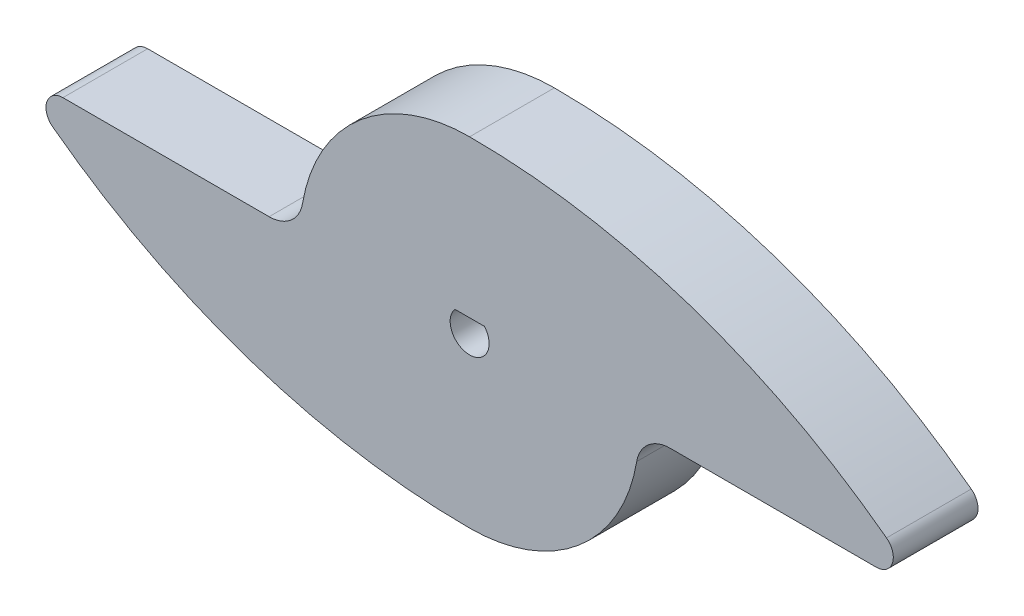
ISO-10303-21;
HEADER;
FILE_DESCRIPTION(('STEP AP214'),'2;1');
FILE_NAME('part.step','',(''),(''),'','','');
FILE_SCHEMA(('AUTOMOTIVE_DESIGN { 1 0 10303 214 1 1 1 1 }'));
ENDSEC;
DATA;
#1=APPLICATION_CONTEXT('core data for automotive mechanical design processes');
#2=APPLICATION_PROTOCOL_DEFINITION('international standard','automotive_design',2000,#1);
#3=PRODUCT_CONTEXT('',#1,'mechanical');
#4=PRODUCT('Part','Part','',(#3));
#5=PRODUCT_RELATED_PRODUCT_CATEGORY('part','',(#4));
#6=PRODUCT_DEFINITION_FORMATION('','',#4);
#7=PRODUCT_DEFINITION_CONTEXT('part definition',#1,'design');
#8=PRODUCT_DEFINITION('design','',#6,#7);
#9=PRODUCT_DEFINITION_SHAPE('','',#8);
#10=(LENGTH_UNIT() NAMED_UNIT(*) SI_UNIT(.MILLI.,.METRE.));
#11=(NAMED_UNIT(*) PLANE_ANGLE_UNIT() SI_UNIT($,.RADIAN.));
#12=(NAMED_UNIT(*) SI_UNIT($,.STERADIAN.) SOLID_ANGLE_UNIT());
#13=UNCERTAINTY_MEASURE_WITH_UNIT(LENGTH_MEASURE(1.E-05),#10,'distance_accuracy_value','');
#14=(GEOMETRIC_REPRESENTATION_CONTEXT(3) GLOBAL_UNCERTAINTY_ASSIGNED_CONTEXT((#13)) GLOBAL_UNIT_ASSIGNED_CONTEXT((#10,
#11,#12)) REPRESENTATION_CONTEXT('',''));
#15=CARTESIAN_POINT('',(0.,0.,0.));
#16=DIRECTION('',(0.,0.,1.));
#17=DIRECTION('',(1.,0.,0.));
#18=AXIS2_PLACEMENT_3D('',#15,#16,#17);
#19=CARTESIAN_POINT('',(0.,0.,6.35));
#20=DIRECTION('',(0.,0.,-1.));
#21=DIRECTION('',(-1.,0.,0.));
#22=AXIS2_PLACEMENT_3D('',#19,#20,#21);
#23=CYLINDRICAL_SURFACE('',#22,1.4605);
#24=DIRECTION('',(0.,0.,-1.));
#25=VECTOR('',#24,1.);
#26=CARTESIAN_POINT('',(1.10716033165933,0.9525,6.35));
#27=LINE('',#26,#25);
#28=CARTESIAN_POINT('',(1.10716033165933,0.9525,6.35));
#29=VERTEX_POINT('',#28);
#30=CARTESIAN_POINT('',(1.10716033165933,0.9525,-4.7625));
#31=VERTEX_POINT('',#30);
#32=EDGE_CURVE('E45',#29,#31,#27,.T.);
#33=ORIENTED_EDGE('',*,*,#32,.T.);
#34=CARTESIAN_POINT('',(0.,0.,-4.7625));
#35=DIRECTION('',(0.,0.,1.));
#36=DIRECTION('',(1.,0.,0.));
#37=AXIS2_PLACEMENT_3D('',#34,#35,#36);
#38=CIRCLE('',#37,1.4605);
#39=CARTESIAN_POINT('',(-1.10716033165933,0.9525,-4.7625));
#40=VERTEX_POINT('',#39);
#41=EDGE_CURVE('E289',#40,#31,#38,.T.);
#42=ORIENTED_EDGE('',*,*,#41,.F.);
#43=DIRECTION('',(0.,0.,-1.));
#44=VECTOR('',#43,1.);
#45=CARTESIAN_POINT('',(-1.10716033165933,0.9525,6.35));
#46=LINE('',#45,#44);
#47=CARTESIAN_POINT('',(-1.10716033165933,0.9525,6.35));
#48=VERTEX_POINT('',#47);
#49=EDGE_CURVE('E11',#48,#40,#46,.T.);
#50=ORIENTED_EDGE('',*,*,#49,.F.);
#51=CARTESIAN_POINT('',(0.,0.,6.35));
#52=DIRECTION('',(0.,0.,1.));
#53=DIRECTION('',(1.,0.,0.));
#54=AXIS2_PLACEMENT_3D('',#51,#52,#53);
#55=CIRCLE('',#54,1.4605);
#56=EDGE_CURVE('E138',#48,#29,#55,.T.);
#57=ORIENTED_EDGE('',*,*,#56,.T.);
#58=EDGE_LOOP('',(#33,#42,#50,#57));
#59=FACE_BOUND('',#58,.T.);
#60=ADVANCED_FACE('F35',(#59),#23,.F.);
#61=CARTESIAN_POINT('',(-15.026842649073,2.54,6.35));
#62=DIRECTION('',(0.,0.,-1.));
#63=DIRECTION('',(-1.,0.,0.));
#64=AXIS2_PLACEMENT_3D('',#61,#62,#63);
#65=CYLINDRICAL_SURFACE('',#64,2.54);
#66=CARTESIAN_POINT('',(-15.026842649073,2.54,0.));
#67=DIRECTION('',(0.,0.,1.));
#68=DIRECTION('',(1.,0.,0.));
#69=AXIS2_PLACEMENT_3D('',#66,#67,#68);
#70=CIRCLE('',#69,2.54);
#71=CARTESIAN_POINT('',(-15.026842649073,0.,0.));
#72=VERTEX_POINT('',#71);
#73=CARTESIAN_POINT('',(-12.5223688742275,2.11666666666667,0.));
#74=VERTEX_POINT('',#73);
#75=EDGE_CURVE('E173',#72,#74,#70,.T.);
#76=ORIENTED_EDGE('',*,*,#75,.F.);
#77=DIRECTION('',(0.,0.,-1.));
#78=VECTOR('',#77,1.);
#79=CARTESIAN_POINT('',(-15.026842649073,0.,6.35));
#80=LINE('',#79,#78);
#81=CARTESIAN_POINT('',(-15.026842649073,0.,6.35));
#82=VERTEX_POINT('',#81);
#83=EDGE_CURVE('E102',#82,#72,#80,.T.);
#84=ORIENTED_EDGE('',*,*,#83,.F.);
#85=CARTESIAN_POINT('',(-15.026842649073,2.54,6.35));
#86=DIRECTION('',(0.,0.,1.));
#87=DIRECTION('',(1.,0.,0.));
#88=AXIS2_PLACEMENT_3D('',#85,#86,#87);
#89=CIRCLE('',#88,2.54);
#90=CARTESIAN_POINT('',(-12.5223688742275,2.11666666666667,6.35));
#91=VERTEX_POINT('',#90);
#92=EDGE_CURVE('E134',#82,#91,#89,.T.);
#93=ORIENTED_EDGE('',*,*,#92,.T.);
#94=DIRECTION('',(0.,0.,-1.));
#95=VECTOR('',#94,1.);
#96=CARTESIAN_POINT('',(-12.5223688742275,2.11666666666667,6.35));
#97=LINE('',#96,#95);
#98=EDGE_CURVE('E98',#91,#74,#97,.T.);
#99=ORIENTED_EDGE('',*,*,#98,.T.);
#100=EDGE_LOOP('',(#76,#84,#93,#99));
#101=FACE_BOUND('',#100,.T.);
#102=ADVANCED_FACE('F37',(#101),#65,.F.);
#103=CARTESIAN_POINT('',(0.,0.,6.35));
#104=DIRECTION('',(0.,-1.,0.));
#105=DIRECTION('',(1.,0.,0.));
#106=AXIS2_PLACEMENT_3D('',#103,#104,#105);
#107=PLANE('',#106);
#108=DIRECTION('',(-1.,0.,0.));
#109=VECTOR('',#108,1.);
#110=CARTESIAN_POINT('',(0.,0.,0.));
#111=LINE('',#110,#109);
#112=CARTESIAN_POINT('',(-30.48,0.,0.));
#113=VERTEX_POINT('',#112);
#114=EDGE_CURVE('E175',#72,#113,#111,.T.);
#115=ORIENTED_EDGE('',*,*,#114,.T.);
#116=DIRECTION('',(0.,0.,-1.));
#117=VECTOR('',#116,1.);
#118=CARTESIAN_POINT('',(-30.48,0.,6.35));
#119=LINE('',#118,#117);
#120=CARTESIAN_POINT('',(-30.48,0.,6.35));
#121=VERTEX_POINT('',#120);
#122=EDGE_CURVE('E213',#121,#113,#119,.T.);
#123=ORIENTED_EDGE('',*,*,#122,.F.);
#124=DIRECTION('',(-1.,0.,0.));
#125=VECTOR('',#124,1.);
#126=CARTESIAN_POINT('',(0.,0.,6.35));
#127=LINE('',#126,#125);
#128=EDGE_CURVE('E144',#82,#121,#127,.T.);
#129=ORIENTED_EDGE('',*,*,#128,.F.);
#130=ORIENTED_EDGE('',*,*,#83,.T.);
#131=EDGE_LOOP('',(#115,#123,#129,#130));
#132=FACE_BOUND('',#131,.T.);
#133=ADVANCED_FACE('F216',(#132),#107,.F.);
#134=CARTESIAN_POINT('',(-30.48,-1.27,6.35));
#135=DIRECTION('',(0.,0.,-1.));
#136=DIRECTION('',(-1.,0.,0.));
#137=AXIS2_PLACEMENT_3D('',#134,#135,#136);
#138=CYLINDRICAL_SURFACE('',#137,1.27);
#139=CARTESIAN_POINT('',(-30.48,-1.27,0.));
#140=DIRECTION('',(0.,0.,1.));
#141=DIRECTION('',(1.,0.,0.));
#142=AXIS2_PLACEMENT_3D('',#139,#140,#141);
#143=CIRCLE('',#142,1.27);
#144=CARTESIAN_POINT('',(-31.242,-2.28600000000002,0.));
#145=VERTEX_POINT('',#144);
#146=EDGE_CURVE('E178',#145,#113,#143,.F.);
#147=ORIENTED_EDGE('',*,*,#146,.F.);
#148=DIRECTION('',(0.,0.,-1.));
#149=VECTOR('',#148,1.);
#150=CARTESIAN_POINT('',(-31.242,-2.28600000000002,6.35));
#151=LINE('',#150,#149);
#152=CARTESIAN_POINT('',(-31.242,-2.28600000000002,6.35));
#153=VERTEX_POINT('',#152);
#154=EDGE_CURVE('E211',#153,#145,#151,.T.);
#155=ORIENTED_EDGE('',*,*,#154,.F.);
#156=CARTESIAN_POINT('',(-30.48,-1.27,6.35));
#157=DIRECTION('',(0.,0.,1.));
#158=DIRECTION('',(1.,0.,0.));
#159=AXIS2_PLACEMENT_3D('',#156,#157,#158);
#160=CIRCLE('',#159,1.27);
#161=EDGE_CURVE('E146',#153,#121,#160,.F.);
#162=ORIENTED_EDGE('',*,*,#161,.T.);
#163=ORIENTED_EDGE('',*,*,#122,.T.);
#164=EDGE_LOOP('',(#147,#155,#162,#163));
#165=FACE_BOUND('',#164,.T.);
#166=ADVANCED_FACE('F224',(#165),#138,.T.);
#167=CARTESIAN_POINT('',(0.,39.37,6.35));
#168=DIRECTION('',(0.,0.,-1.));
#169=DIRECTION('',(-1.,0.,0.));
#170=AXIS2_PLACEMENT_3D('',#167,#168,#169);
#171=CYLINDRICAL_SURFACE('',#170,52.07);
#172=CARTESIAN_POINT('',(0.,39.37,0.));
#173=DIRECTION('',(0.,0.,1.));
#174=DIRECTION('',(1.,0.,0.));
#175=AXIS2_PLACEMENT_3D('',#172,#173,#174);
#176=CIRCLE('',#175,52.07);
#177=CARTESIAN_POINT('',(0.,-12.7,0.));
#178=VERTEX_POINT('',#177);
#179=EDGE_CURVE('E181',#178,#145,#176,.F.);
#180=ORIENTED_EDGE('',*,*,#179,.F.);
#181=DIRECTION('',(0.,0.,-1.));
#182=VECTOR('',#181,1.);
#183=CARTESIAN_POINT('',(0.,-12.7,6.35));
#184=LINE('',#183,#182);
#185=CARTESIAN_POINT('',(0.,-12.7,6.35));
#186=VERTEX_POINT('',#185);
#187=EDGE_CURVE('E209',#186,#178,#184,.T.);
#188=ORIENTED_EDGE('',*,*,#187,.F.);
#189=CARTESIAN_POINT('',(0.,39.37,6.35));
#190=DIRECTION('',(0.,0.,1.));
#191=DIRECTION('',(1.,0.,0.));
#192=AXIS2_PLACEMENT_3D('',#189,#190,#191);
#193=CIRCLE('',#192,52.07);
#194=EDGE_CURVE('E156',#186,#153,#193,.F.);
#195=ORIENTED_EDGE('',*,*,#194,.T.);
#196=ORIENTED_EDGE('',*,*,#154,.T.);
#197=EDGE_LOOP('',(#180,#188,#195,#196));
#198=FACE_BOUND('',#197,.T.);
#199=ADVANCED_FACE('F228',(#198),#171,.T.);
#200=CARTESIAN_POINT('',(0.,0.,6.35));
#201=DIRECTION('',(0.,0.,-1.));
#202=DIRECTION('',(-1.,0.,0.));
#203=AXIS2_PLACEMENT_3D('',#200,#201,#202);
#204=CYLINDRICAL_SURFACE('',#203,12.7);
#205=CARTESIAN_POINT('',(0.,0.,0.));
#206=DIRECTION('',(0.,0.,1.));
#207=DIRECTION('',(1.,0.,0.));
#208=AXIS2_PLACEMENT_3D('',#205,#206,#207);
#209=CIRCLE('',#208,12.7);
#210=CARTESIAN_POINT('',(12.5223688742275,-2.11666666666668,0.));
#211=VERTEX_POINT('',#210);
#212=EDGE_CURVE('E184',#178,#211,#209,.T.);
#213=ORIENTED_EDGE('',*,*,#212,.T.);
#214=DIRECTION('',(0.,0.,-1.));
#215=VECTOR('',#214,1.);
#216=CARTESIAN_POINT('',(12.5223688742275,-2.11666666666668,6.35));
#217=LINE('',#216,#215);
#218=CARTESIAN_POINT('',(12.5223688742275,-2.11666666666668,6.35));
#219=VERTEX_POINT('',#218);
#220=EDGE_CURVE('E207',#219,#211,#217,.T.);
#221=ORIENTED_EDGE('',*,*,#220,.F.);
#222=CARTESIAN_POINT('',(0.,0.,6.35));
#223=DIRECTION('',(0.,0.,1.));
#224=DIRECTION('',(1.,0.,0.));
#225=AXIS2_PLACEMENT_3D('',#222,#223,#224);
#226=CIRCLE('',#225,12.7);
#227=EDGE_CURVE('E159',#186,#219,#226,.T.);
#228=ORIENTED_EDGE('',*,*,#227,.F.);
#229=ORIENTED_EDGE('',*,*,#187,.T.);
#230=EDGE_LOOP('',(#213,#221,#228,#229));
#231=FACE_BOUND('',#230,.T.);
#232=ADVANCED_FACE('F232',(#231),#204,.T.);
#233=CARTESIAN_POINT('',(15.026842649073,-2.54,6.35));
#234=DIRECTION('',(0.,0.,-1.));
#235=DIRECTION('',(-1.,0.,0.));
#236=AXIS2_PLACEMENT_3D('',#233,#234,#235);
#237=CYLINDRICAL_SURFACE('',#236,2.54);
#238=CARTESIAN_POINT('',(15.026842649073,-2.54,0.));
#239=DIRECTION('',(0.,0.,1.));
#240=DIRECTION('',(1.,0.,0.));
#241=AXIS2_PLACEMENT_3D('',#238,#239,#240);
#242=CIRCLE('',#241,2.54);
#243=CARTESIAN_POINT('',(15.026842649073,0.,0.));
#244=VERTEX_POINT('',#243);
#245=EDGE_CURVE('E187',#244,#211,#242,.T.);
#246=ORIENTED_EDGE('',*,*,#245,.F.);
#247=DIRECTION('',(0.,0.,-1.));
#248=VECTOR('',#247,1.);
#249=CARTESIAN_POINT('',(15.026842649073,0.,6.35));
#250=LINE('',#249,#248);
#251=CARTESIAN_POINT('',(15.026842649073,0.,6.35));
#252=VERTEX_POINT('',#251);
#253=EDGE_CURVE('E205',#252,#244,#250,.T.);
#254=ORIENTED_EDGE('',*,*,#253,.F.);
#255=CARTESIAN_POINT('',(15.026842649073,-2.54,6.35));
#256=DIRECTION('',(0.,0.,1.));
#257=DIRECTION('',(1.,0.,0.));
#258=AXIS2_PLACEMENT_3D('',#255,#256,#257);
#259=CIRCLE('',#258,2.54);
#260=EDGE_CURVE('E161',#252,#219,#259,.T.);
#261=ORIENTED_EDGE('',*,*,#260,.T.);
#262=ORIENTED_EDGE('',*,*,#220,.T.);
#263=EDGE_LOOP('',(#246,#254,#261,#262));
#264=FACE_BOUND('',#263,.T.);
#265=ADVANCED_FACE('F238',(#264),#237,.F.);
#266=CARTESIAN_POINT('',(0.,0.,6.35));
#267=DIRECTION('',(0.,1.,0.));
#268=DIRECTION('',(0.,0.,1.));
#269=AXIS2_PLACEMENT_3D('',#266,#267,#268);
#270=PLANE('',#269);
#271=DIRECTION('',(1.,0.,0.));
#272=VECTOR('',#271,1.);
#273=CARTESIAN_POINT('',(0.,0.,0.));
#274=LINE('',#273,#272);
#275=CARTESIAN_POINT('',(30.48,0.,0.));
#276=VERTEX_POINT('',#275);
#277=EDGE_CURVE('E190',#244,#276,#274,.T.);
#278=ORIENTED_EDGE('',*,*,#277,.T.);
#279=DIRECTION('',(0.,0.,-1.));
#280=VECTOR('',#279,1.);
#281=CARTESIAN_POINT('',(30.48,0.,6.35));
#282=LINE('',#281,#280);
#283=CARTESIAN_POINT('',(30.48,0.,6.35));
#284=VERTEX_POINT('',#283);
#285=EDGE_CURVE('E203',#284,#276,#282,.T.);
#286=ORIENTED_EDGE('',*,*,#285,.F.);
#287=DIRECTION('',(1.,0.,0.));
#288=VECTOR('',#287,1.);
#289=CARTESIAN_POINT('',(0.,0.,6.35));
#290=LINE('',#289,#288);
#291=EDGE_CURVE('E164',#252,#284,#290,.T.);
#292=ORIENTED_EDGE('',*,*,#291,.F.);
#293=ORIENTED_EDGE('',*,*,#253,.T.);
#294=EDGE_LOOP('',(#278,#286,#292,#293));
#295=FACE_BOUND('',#294,.T.);
#296=ADVANCED_FACE('F241',(#295),#270,.F.);
#297=CARTESIAN_POINT('',(30.48,1.27,6.35));
#298=DIRECTION('',(0.,0.,-1.));
#299=DIRECTION('',(-1.,0.,0.));
#300=AXIS2_PLACEMENT_3D('',#297,#298,#299);
#301=CYLINDRICAL_SURFACE('',#300,1.27);
#302=CARTESIAN_POINT('',(30.48,1.27,0.));
#303=DIRECTION('',(0.,0.,1.));
#304=DIRECTION('',(1.,0.,0.));
#305=AXIS2_PLACEMENT_3D('',#302,#303,#304);
#306=CIRCLE('',#305,1.27);
#307=CARTESIAN_POINT('',(31.242,2.28600000000001,0.));
#308=VERTEX_POINT('',#307);
#309=EDGE_CURVE('E193',#308,#276,#306,.F.);
#310=ORIENTED_EDGE('',*,*,#309,.F.);
#311=DIRECTION('',(0.,0.,-1.));
#312=VECTOR('',#311,1.);
#313=CARTESIAN_POINT('',(31.242,2.28600000000001,6.35));
#314=LINE('',#313,#312);
#315=CARTESIAN_POINT('',(31.242,2.28600000000001,6.35));
#316=VERTEX_POINT('',#315);
#317=EDGE_CURVE('E201',#316,#308,#314,.T.);
#318=ORIENTED_EDGE('',*,*,#317,.F.);
#319=CARTESIAN_POINT('',(30.48,1.27,6.35));
#320=DIRECTION('',(0.,0.,1.));
#321=DIRECTION('',(1.,0.,0.));
#322=AXIS2_PLACEMENT_3D('',#319,#320,#321);
#323=CIRCLE('',#322,1.27);
#324=EDGE_CURVE('E166',#316,#284,#323,.F.);
#325=ORIENTED_EDGE('',*,*,#324,.T.);
#326=ORIENTED_EDGE('',*,*,#285,.T.);
#327=EDGE_LOOP('',(#310,#318,#325,#326));
#328=FACE_BOUND('',#327,.T.);
#329=ADVANCED_FACE('F244',(#328),#301,.T.);
#330=CARTESIAN_POINT('',(0.,-39.37,6.35));
#331=DIRECTION('',(0.,0.,-1.));
#332=DIRECTION('',(-1.,0.,0.));
#333=AXIS2_PLACEMENT_3D('',#330,#331,#332);
#334=CYLINDRICAL_SURFACE('',#333,52.07);
#335=CARTESIAN_POINT('',(0.,-39.37,0.));
#336=DIRECTION('',(0.,0.,1.));
#337=DIRECTION('',(1.,0.,0.));
#338=AXIS2_PLACEMENT_3D('',#335,#336,#337);
#339=CIRCLE('',#338,52.07);
#340=CARTESIAN_POINT('',(0.,12.7,0.));
#341=VERTEX_POINT('',#340);
#342=EDGE_CURVE('E148',#341,#308,#339,.F.);
#343=ORIENTED_EDGE('',*,*,#342,.F.);
#344=DIRECTION('',(0.,0.,-1.));
#345=VECTOR('',#344,1.);
#346=CARTESIAN_POINT('',(0.,12.7,6.35));
#347=LINE('',#346,#345);
#348=CARTESIAN_POINT('',(0.,12.7,6.35));
#349=VERTEX_POINT('',#348);
#350=EDGE_CURVE('E90',#349,#341,#347,.T.);
#351=ORIENTED_EDGE('',*,*,#350,.F.);
#352=CARTESIAN_POINT('',(0.,-39.37,6.35));
#353=DIRECTION('',(0.,0.,1.));
#354=DIRECTION('',(1.,0.,0.));
#355=AXIS2_PLACEMENT_3D('',#352,#353,#354);
#356=CIRCLE('',#355,52.07);
#357=EDGE_CURVE('E137',#349,#316,#356,.F.);
#358=ORIENTED_EDGE('',*,*,#357,.T.);
#359=ORIENTED_EDGE('',*,*,#317,.T.);
#360=EDGE_LOOP('',(#343,#351,#358,#359));
#361=FACE_BOUND('',#360,.T.);
#362=ADVANCED_FACE('F247',(#361),#334,.T.);
#363=CARTESIAN_POINT('',(0.,0.,6.35));
#364=DIRECTION('',(0.,0.,-1.));
#365=DIRECTION('',(-1.,0.,0.));
#366=AXIS2_PLACEMENT_3D('',#363,#364,#365);
#367=CYLINDRICAL_SURFACE('',#366,12.7);
#368=CARTESIAN_POINT('',(0.,0.,0.));
#369=DIRECTION('',(0.,0.,1.));
#370=DIRECTION('',(1.,0.,0.));
#371=AXIS2_PLACEMENT_3D('',#368,#369,#370);
#372=CIRCLE('',#371,12.7);
#373=EDGE_CURVE('E141',#341,#74,#372,.T.);
#374=ORIENTED_EDGE('',*,*,#373,.T.);
#375=ORIENTED_EDGE('',*,*,#98,.F.);
#376=CARTESIAN_POINT('',(0.,0.,6.35));
#377=DIRECTION('',(0.,0.,1.));
#378=DIRECTION('',(1.,0.,0.));
#379=AXIS2_PLACEMENT_3D('',#376,#377,#378);
#380=CIRCLE('',#379,12.7);
#381=EDGE_CURVE('E132',#349,#91,#380,.T.);
#382=ORIENTED_EDGE('',*,*,#381,.F.);
#383=ORIENTED_EDGE('',*,*,#350,.T.);
#384=EDGE_LOOP('',(#374,#375,#382,#383));
#385=FACE_BOUND('',#384,.T.);
#386=ADVANCED_FACE('F140',(#385),#367,.T.);
#387=CARTESIAN_POINT('',(0.,0.9525,6.35));
#388=DIRECTION('',(0.,1.,0.));
#389=DIRECTION('',(0.,0.,1.));
#390=AXIS2_PLACEMENT_3D('',#387,#388,#389);
#391=PLANE('',#390);
#392=ORIENTED_EDGE('',*,*,#49,.T.);
#393=DIRECTION('',(-1.,0.,0.));
#394=VECTOR('',#393,1.);
#395=CARTESIAN_POINT('',(-1.10716033165933,0.9525,-4.7625));
#396=LINE('',#395,#394);
#397=EDGE_CURVE('E285',#31,#40,#396,.T.);
#398=ORIENTED_EDGE('',*,*,#397,.F.);
#399=ORIENTED_EDGE('',*,*,#32,.F.);
#400=DIRECTION('',(1.,0.,0.));
#401=VECTOR('',#400,1.);
#402=CARTESIAN_POINT('',(0.,0.9525,6.35));
#403=LINE('',#402,#401);
#404=EDGE_CURVE('E53',#48,#29,#403,.T.);
#405=ORIENTED_EDGE('',*,*,#404,.F.);
#406=EDGE_LOOP('',(#392,#398,#399,#405));
#407=FACE_BOUND('',#406,.T.);
#408=ADVANCED_FACE('F254',(#407),#391,.F.);
#409=CARTESIAN_POINT('',(0.,0.,6.35));
#410=DIRECTION('',(0.,0.,1.));
#411=DIRECTION('',(1.,0.,0.));
#412=AXIS2_PLACEMENT_3D('',#409,#410,#411);
#413=PLANE('',#412);
#414=ORIENTED_EDGE('',*,*,#92,.F.);
#415=ORIENTED_EDGE('',*,*,#128,.T.);
#416=ORIENTED_EDGE('',*,*,#161,.F.);
#417=ORIENTED_EDGE('',*,*,#194,.F.);
#418=ORIENTED_EDGE('',*,*,#227,.T.);
#419=ORIENTED_EDGE('',*,*,#260,.F.);
#420=ORIENTED_EDGE('',*,*,#291,.T.);
#421=ORIENTED_EDGE('',*,*,#324,.F.);
#422=ORIENTED_EDGE('',*,*,#357,.F.);
#423=ORIENTED_EDGE('',*,*,#381,.T.);
#424=EDGE_LOOP('',(#414,#415,#416,#417,#418,#419,#420,#421,#422,#423));
#425=FACE_BOUND('',#424,.T.);
#426=ORIENTED_EDGE('',*,*,#56,.F.);
#427=ORIENTED_EDGE('',*,*,#404,.T.);
#428=EDGE_LOOP('',(#426,#427));
#429=FACE_BOUND('',#428,.T.);
#430=ADVANCED_FACE('F133',(#425,#429),#413,.T.);
#431=CARTESIAN_POINT('',(0.,0.,0.));
#432=DIRECTION('',(0.,0.,1.));
#433=DIRECTION('',(1.,0.,0.));
#434=AXIS2_PLACEMENT_3D('',#431,#432,#433);
#435=PLANE('',#434);
#436=CARTESIAN_POINT('',(0.,0.,0.));
#437=DIRECTION('',(0.,0.,1.));
#438=DIRECTION('',(1.,0.,0.));
#439=AXIS2_PLACEMENT_3D('',#436,#437,#438);
#440=CIRCLE('',#439,3.175);
#441=CARTESIAN_POINT('',(3.175,0.,0.));
#442=VERTEX_POINT('',#441);
#443=EDGE_CURVE('E39',#442,#442,#440,.T.);
#444=ORIENTED_EDGE('',*,*,#443,.T.);
#445=EDGE_LOOP('',(#444));
#446=FACE_BOUND('',#445,.T.);
#447=ORIENTED_EDGE('',*,*,#75,.T.);
#448=ORIENTED_EDGE('',*,*,#373,.F.);
#449=ORIENTED_EDGE('',*,*,#342,.T.);
#450=ORIENTED_EDGE('',*,*,#309,.T.);
#451=ORIENTED_EDGE('',*,*,#277,.F.);
#452=ORIENTED_EDGE('',*,*,#245,.T.);
#453=ORIENTED_EDGE('',*,*,#212,.F.);
#454=ORIENTED_EDGE('',*,*,#179,.T.);
#455=ORIENTED_EDGE('',*,*,#146,.T.);
#456=ORIENTED_EDGE('',*,*,#114,.F.);
#457=EDGE_LOOP('',(#447,#448,#449,#450,#451,#452,#453,#454,#455,#456));
#458=FACE_BOUND('',#457,.T.);
#459=ADVANCED_FACE('F219',(#446,#458),#435,.F.);
#460=CARTESIAN_POINT('',(0.,0.,-4.7625));
#461=DIRECTION('',(0.,0.,1.));
#462=DIRECTION('',(1.,0.,0.));
#463=AXIS2_PLACEMENT_3D('',#460,#461,#462);
#464=CYLINDRICAL_SURFACE('',#463,3.175);
#465=CARTESIAN_POINT('',(0.,0.,-4.7625));
#466=DIRECTION('',(0.,0.,1.));
#467=DIRECTION('',(1.,0.,0.));
#468=AXIS2_PLACEMENT_3D('',#465,#466,#467);
#469=CIRCLE('',#468,3.175);
#470=CARTESIAN_POINT('',(3.175,0.,-4.7625));
#471=VERTEX_POINT('',#470);
#472=EDGE_CURVE('E151',#471,#471,#469,.T.);
#473=ORIENTED_EDGE('',*,*,#472,.T.);
#474=EDGE_LOOP('',(#473));
#475=FACE_BOUND('',#474,.T.);
#476=ORIENTED_EDGE('',*,*,#443,.F.);
#477=EDGE_LOOP('',(#476));
#478=FACE_BOUND('',#477,.T.);
#479=ADVANCED_FACE('F269',(#475,#478),#464,.T.);
#480=CARTESIAN_POINT('',(0.,0.,-4.7625));
#481=DIRECTION('',(0.,0.,1.));
#482=DIRECTION('',(1.,0.,0.));
#483=AXIS2_PLACEMENT_3D('',#480,#481,#482);
#484=PLANE('',#483);
#485=ORIENTED_EDGE('',*,*,#397,.T.);
#486=ORIENTED_EDGE('',*,*,#41,.T.);
#487=EDGE_LOOP('',(#485,#486));
#488=FACE_BOUND('',#487,.T.);
#489=ORIENTED_EDGE('',*,*,#472,.F.);
#490=EDGE_LOOP('',(#489));
#491=FACE_BOUND('',#490,.T.);
#492=ADVANCED_FACE('F275',(#488,#491),#484,.F.);
#493=CLOSED_SHELL('',(#60,#102,#133,#166,#199,#232,#265,#296,#329,#362,#386,#408,#430,#459,#479,#492));
#494=MANIFOLD_SOLID_BREP('B2',#493);
#495=ADVANCED_BREP_SHAPE_REPRESENTATION('',(#18,#494),#14);
#496=SHAPE_DEFINITION_REPRESENTATION(#9,#495);
ENDSEC;
END-ISO-10303-21;
